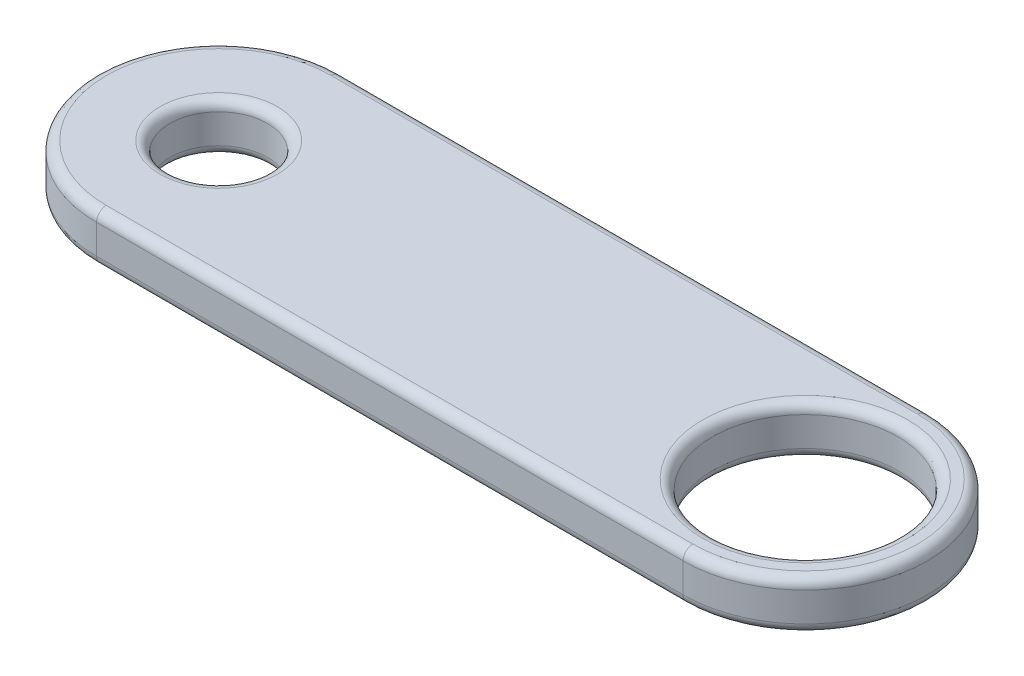
ISO-10303-21;
HEADER;
FILE_DESCRIPTION(('STEP AP214'),'2;1');
FILE_NAME('part.step','',(''),(''),'','','');
FILE_SCHEMA(('AUTOMOTIVE_DESIGN { 1 0 10303 214 1 1 1 1 }'));
ENDSEC;
DATA;
#1=APPLICATION_CONTEXT('core data for automotive mechanical design processes');
#2=APPLICATION_PROTOCOL_DEFINITION('international standard','automotive_design',2000,#1);
#3=PRODUCT_CONTEXT('',#1,'mechanical');
#4=PRODUCT('Part','Part','',(#3));
#5=PRODUCT_RELATED_PRODUCT_CATEGORY('part','',(#4));
#6=PRODUCT_DEFINITION_FORMATION('','',#4);
#7=PRODUCT_DEFINITION_CONTEXT('part definition',#1,'design');
#8=PRODUCT_DEFINITION('design','',#6,#7);
#9=PRODUCT_DEFINITION_SHAPE('','',#8);
#10=(LENGTH_UNIT() NAMED_UNIT(*) SI_UNIT(.MILLI.,.METRE.));
#11=(NAMED_UNIT(*) PLANE_ANGLE_UNIT() SI_UNIT($,.RADIAN.));
#12=(NAMED_UNIT(*) SI_UNIT($,.STERADIAN.) SOLID_ANGLE_UNIT());
#13=UNCERTAINTY_MEASURE_WITH_UNIT(LENGTH_MEASURE(1.E-05),#10,'distance_accuracy_value','');
#14=(GEOMETRIC_REPRESENTATION_CONTEXT(3) GLOBAL_UNCERTAINTY_ASSIGNED_CONTEXT((#13)) GLOBAL_UNIT_ASSIGNED_CONTEXT((#10,
#11,#12)) REPRESENTATION_CONTEXT('',''));
#15=CARTESIAN_POINT('',(0.,0.,0.));
#16=DIRECTION('',(0.,0.,1.));
#17=DIRECTION('',(1.,0.,0.));
#18=AXIS2_PLACEMENT_3D('',#15,#16,#17);
#19=CARTESIAN_POINT('',(0.,2.5,0.));
#20=DIRECTION('',(0.,1.,0.));
#21=DIRECTION('',(0.,0.,1.));
#22=AXIS2_PLACEMENT_3D('',#19,#20,#21);
#23=PLANE('',#22);
#24=CARTESIAN_POINT('',(60.,2.5,0.));
#25=DIRECTION('',(0.,1.,0.));
#26=DIRECTION('',(0.,0.,1.));
#27=AXIS2_PLACEMENT_3D('',#24,#25,#26);
#28=CIRCLE('',#27,10.5);
#29=CARTESIAN_POINT('',(60.,2.5,10.5));
#30=VERTEX_POINT('',#29);
#31=EDGE_CURVE('E11',#30,#30,#28,.F.);
#32=ORIENTED_EDGE('',*,*,#31,.T.);
#33=EDGE_LOOP('',(#32));
#34=FACE_BOUND('',#33,.T.);
#35=CARTESIAN_POINT('',(60.,2.5,0.));
#36=DIRECTION('',(0.,1.,0.));
#37=DIRECTION('',(0.,0.,1.));
#38=AXIS2_PLACEMENT_3D('',#35,#36,#37);
#39=CIRCLE('',#38,11.5);
#40=CARTESIAN_POINT('',(60.,2.5,11.5));
#41=VERTEX_POINT('',#40);
#42=CARTESIAN_POINT('',(60.,2.5,-11.5));
#43=VERTEX_POINT('',#42);
#44=EDGE_CURVE('E57',#41,#43,#39,.T.);
#45=ORIENTED_EDGE('',*,*,#44,.T.);
#46=DIRECTION('',(-1.,0.,0.));
#47=VECTOR('',#46,1.);
#48=CARTESIAN_POINT('',(0.,2.5,-11.5));
#49=LINE('',#48,#47);
#50=CARTESIAN_POINT('',(0.,2.5,-11.5));
#51=VERTEX_POINT('',#50);
#52=EDGE_CURVE('E49',#43,#51,#49,.T.);
#53=ORIENTED_EDGE('',*,*,#52,.T.);
#54=CARTESIAN_POINT('',(0.,2.5,0.));
#55=DIRECTION('',(0.,1.,0.));
#56=DIRECTION('',(0.,0.,1.));
#57=AXIS2_PLACEMENT_3D('',#54,#55,#56);
#58=CIRCLE('',#57,11.5);
#59=CARTESIAN_POINT('',(0.,2.5,11.5));
#60=VERTEX_POINT('',#59);
#61=EDGE_CURVE('E194',#51,#60,#58,.T.);
#62=ORIENTED_EDGE('',*,*,#61,.T.);
#63=DIRECTION('',(1.,0.,0.));
#64=VECTOR('',#63,1.);
#65=CARTESIAN_POINT('',(60.,2.5,11.5));
#66=LINE('',#65,#64);
#67=EDGE_CURVE('E62',#60,#41,#66,.T.);
#68=ORIENTED_EDGE('',*,*,#67,.T.);
#69=EDGE_LOOP('',(#45,#53,#62,#68));
#70=FACE_BOUND('',#69,.T.);
#71=CARTESIAN_POINT('',(0.,2.5,0.));
#72=DIRECTION('',(0.,1.,0.));
#73=DIRECTION('',(0.,0.,1.));
#74=AXIS2_PLACEMENT_3D('',#71,#72,#73);
#75=CIRCLE('',#74,6.);
#76=CARTESIAN_POINT('',(0.,2.5,6.));
#77=VERTEX_POINT('',#76);
#78=EDGE_CURVE('E190',#77,#77,#75,.F.);
#79=ORIENTED_EDGE('',*,*,#78,.T.);
#80=EDGE_LOOP('',(#79));
#81=FACE_BOUND('',#80,.T.);
#82=ADVANCED_FACE('F39',(#34,#70,#81),#23,.T.);
#83=CARTESIAN_POINT('',(0.,-2.5,0.));
#84=DIRECTION('',(0.,1.,0.));
#85=DIRECTION('',(0.,0.,1.));
#86=AXIS2_PLACEMENT_3D('',#83,#84,#85);
#87=PLANE('',#86);
#88=CARTESIAN_POINT('',(60.,-2.5,0.));
#89=DIRECTION('',(0.,1.,0.));
#90=DIRECTION('',(0.,0.,1.));
#91=AXIS2_PLACEMENT_3D('',#88,#89,#90);
#92=CIRCLE('',#91,10.5);
#93=CARTESIAN_POINT('',(60.,-2.5,10.5));
#94=VERTEX_POINT('',#93);
#95=EDGE_CURVE('E142',#94,#94,#92,.T.);
#96=ORIENTED_EDGE('',*,*,#95,.T.);
#97=EDGE_LOOP('',(#96));
#98=FACE_BOUND('',#97,.T.);
#99=CARTESIAN_POINT('',(0.,-2.5,0.));
#100=DIRECTION('',(0.,1.,0.));
#101=DIRECTION('',(0.,0.,1.));
#102=AXIS2_PLACEMENT_3D('',#99,#100,#101);
#103=CIRCLE('',#102,6.);
#104=CARTESIAN_POINT('',(0.,-2.5,6.));
#105=VERTEX_POINT('',#104);
#106=EDGE_CURVE('E137',#105,#105,#103,.T.);
#107=ORIENTED_EDGE('',*,*,#106,.T.);
#108=EDGE_LOOP('',(#107));
#109=FACE_BOUND('',#108,.T.);
#110=CARTESIAN_POINT('',(60.,-2.5,0.));
#111=DIRECTION('',(0.,1.,0.));
#112=DIRECTION('',(0.,0.,1.));
#113=AXIS2_PLACEMENT_3D('',#110,#111,#112);
#114=CIRCLE('',#113,11.5);
#115=CARTESIAN_POINT('',(60.,-2.5,-11.5));
#116=VERTEX_POINT('',#115);
#117=CARTESIAN_POINT('',(60.,-2.5,11.5));
#118=VERTEX_POINT('',#117);
#119=EDGE_CURVE('E135',#116,#118,#114,.F.);
#120=ORIENTED_EDGE('',*,*,#119,.T.);
#121=DIRECTION('',(1.,0.,0.));
#122=VECTOR('',#121,1.);
#123=CARTESIAN_POINT('',(0.,-2.5,11.5));
#124=LINE('',#123,#122);
#125=CARTESIAN_POINT('',(0.,-2.5,11.5));
#126=VERTEX_POINT('',#125);
#127=EDGE_CURVE('E112',#118,#126,#124,.F.);
#128=ORIENTED_EDGE('',*,*,#127,.T.);
#129=CARTESIAN_POINT('',(0.,-2.5,0.));
#130=DIRECTION('',(0.,1.,0.));
#131=DIRECTION('',(0.,0.,1.));
#132=AXIS2_PLACEMENT_3D('',#129,#130,#131);
#133=CIRCLE('',#132,11.5);
#134=CARTESIAN_POINT('',(0.,-2.5,-11.5));
#135=VERTEX_POINT('',#134);
#136=EDGE_CURVE('E123',#126,#135,#133,.F.);
#137=ORIENTED_EDGE('',*,*,#136,.T.);
#138=DIRECTION('',(-1.,0.,0.));
#139=VECTOR('',#138,1.);
#140=CARTESIAN_POINT('',(0.,-2.5,-11.5));
#141=LINE('',#140,#139);
#142=EDGE_CURVE('E130',#135,#116,#141,.F.);
#143=ORIENTED_EDGE('',*,*,#142,.T.);
#144=EDGE_LOOP('',(#120,#128,#137,#143));
#145=FACE_BOUND('',#144,.T.);
#146=ADVANCED_FACE('F133',(#98,#109,#145),#87,.F.);
#147=CARTESIAN_POINT('',(0.,2.5,0.));
#148=DIRECTION('',(0.,-1.,0.));
#149=DIRECTION('',(0.,0.,-1.));
#150=AXIS2_PLACEMENT_3D('',#147,#148,#149);
#151=CYLINDRICAL_SURFACE('',#150,12.5);
#152=DIRECTION('',(0.,-1.,0.));
#153=VECTOR('',#152,1.);
#154=CARTESIAN_POINT('',(0.,2.5,-12.5));
#155=LINE('',#154,#153);
#156=CARTESIAN_POINT('',(0.,1.5,-12.5));
#157=VERTEX_POINT('',#156);
#158=CARTESIAN_POINT('',(0.,-1.5,-12.5));
#159=VERTEX_POINT('',#158);
#160=EDGE_CURVE('E210',#157,#159,#155,.T.);
#161=ORIENTED_EDGE('',*,*,#160,.T.);
#162=CARTESIAN_POINT('',(0.,-1.5,0.));
#163=DIRECTION('',(0.,1.,0.));
#164=DIRECTION('',(0.,0.,1.));
#165=AXIS2_PLACEMENT_3D('',#162,#163,#164);
#166=CIRCLE('',#165,12.5);
#167=CARTESIAN_POINT('',(0.,-1.5,12.5));
#168=VERTEX_POINT('',#167);
#169=EDGE_CURVE('E187',#159,#168,#166,.T.);
#170=ORIENTED_EDGE('',*,*,#169,.T.);
#171=DIRECTION('',(0.,-1.,0.));
#172=VECTOR('',#171,1.);
#173=CARTESIAN_POINT('',(0.,2.5,12.5));
#174=LINE('',#173,#172);
#175=CARTESIAN_POINT('',(0.,1.5,12.5));
#176=VERTEX_POINT('',#175);
#177=EDGE_CURVE('E131',#176,#168,#174,.T.);
#178=ORIENTED_EDGE('',*,*,#177,.F.);
#179=CARTESIAN_POINT('',(0.,1.5,0.));
#180=DIRECTION('',(0.,1.,0.));
#181=DIRECTION('',(0.,0.,1.));
#182=AXIS2_PLACEMENT_3D('',#179,#180,#181);
#183=CIRCLE('',#182,12.5);
#184=EDGE_CURVE('E184',#176,#157,#183,.F.);
#185=ORIENTED_EDGE('',*,*,#184,.T.);
#186=EDGE_LOOP('',(#161,#170,#178,#185));
#187=FACE_BOUND('',#186,.T.);
#188=ADVANCED_FACE('F240',(#187),#151,.T.);
#189=CARTESIAN_POINT('',(0.,2.5,12.5));
#190=DIRECTION('',(0.,0.,-1.));
#191=DIRECTION('',(-1.,0.,0.));
#192=AXIS2_PLACEMENT_3D('',#189,#190,#191);
#193=PLANE('',#192);
#194=ORIENTED_EDGE('',*,*,#177,.T.);
#195=DIRECTION('',(1.,0.,0.));
#196=VECTOR('',#195,1.);
#197=CARTESIAN_POINT('',(0.,-1.5,12.5));
#198=LINE('',#197,#196);
#199=CARTESIAN_POINT('',(60.,-1.5,12.5));
#200=VERTEX_POINT('',#199);
#201=EDGE_CURVE('E115',#168,#200,#198,.T.);
#202=ORIENTED_EDGE('',*,*,#201,.T.);
#203=DIRECTION('',(0.,-1.,0.));
#204=VECTOR('',#203,1.);
#205=CARTESIAN_POINT('',(60.,2.5,12.5));
#206=LINE('',#205,#204);
#207=CARTESIAN_POINT('',(60.,1.5,12.5));
#208=VERTEX_POINT('',#207);
#209=EDGE_CURVE('E237',#208,#200,#206,.T.);
#210=ORIENTED_EDGE('',*,*,#209,.F.);
#211=DIRECTION('',(1.,0.,0.));
#212=VECTOR('',#211,1.);
#213=CARTESIAN_POINT('',(0.,1.5,12.5));
#214=LINE('',#213,#212);
#215=EDGE_CURVE('E166',#208,#176,#214,.F.);
#216=ORIENTED_EDGE('',*,*,#215,.T.);
#217=EDGE_LOOP('',(#194,#202,#210,#216));
#218=FACE_BOUND('',#217,.T.);
#219=ADVANCED_FACE('F235',(#218),#193,.F.);
#220=CARTESIAN_POINT('',(60.,2.5,0.));
#221=DIRECTION('',(0.,-1.,0.));
#222=DIRECTION('',(0.,0.,-1.));
#223=AXIS2_PLACEMENT_3D('',#220,#221,#222);
#224=CYLINDRICAL_SURFACE('',#223,12.5);
#225=ORIENTED_EDGE('',*,*,#209,.T.);
#226=CARTESIAN_POINT('',(60.,-1.5,0.));
#227=DIRECTION('',(0.,1.,0.));
#228=DIRECTION('',(0.,0.,1.));
#229=AXIS2_PLACEMENT_3D('',#226,#227,#228);
#230=CIRCLE('',#229,12.5);
#231=CARTESIAN_POINT('',(60.,-1.5,-12.5));
#232=VERTEX_POINT('',#231);
#233=EDGE_CURVE('E174',#200,#232,#230,.T.);
#234=ORIENTED_EDGE('',*,*,#233,.T.);
#235=DIRECTION('',(0.,-1.,0.));
#236=VECTOR('',#235,1.);
#237=CARTESIAN_POINT('',(60.,2.5,-12.5));
#238=LINE('',#237,#236);
#239=CARTESIAN_POINT('',(60.,1.5,-12.5));
#240=VERTEX_POINT('',#239);
#241=EDGE_CURVE('E245',#240,#232,#238,.T.);
#242=ORIENTED_EDGE('',*,*,#241,.F.);
#243=CARTESIAN_POINT('',(60.,1.5,0.));
#244=DIRECTION('',(0.,1.,0.));
#245=DIRECTION('',(0.,0.,1.));
#246=AXIS2_PLACEMENT_3D('',#243,#244,#245);
#247=CIRCLE('',#246,12.5);
#248=EDGE_CURVE('E171',#240,#208,#247,.F.);
#249=ORIENTED_EDGE('',*,*,#248,.T.);
#250=EDGE_LOOP('',(#225,#234,#242,#249));
#251=FACE_BOUND('',#250,.T.);
#252=ADVANCED_FACE('F259',(#251),#224,.T.);
#253=CARTESIAN_POINT('',(0.,2.5,-12.5));
#254=DIRECTION('',(0.,0.,1.));
#255=DIRECTION('',(1.,0.,0.));
#256=AXIS2_PLACEMENT_3D('',#253,#254,#255);
#257=PLANE('',#256);
#258=ORIENTED_EDGE('',*,*,#241,.T.);
#259=DIRECTION('',(-1.,0.,0.));
#260=VECTOR('',#259,1.);
#261=CARTESIAN_POINT('',(0.,-1.5,-12.5));
#262=LINE('',#261,#260);
#263=EDGE_CURVE('E181',#232,#159,#262,.T.);
#264=ORIENTED_EDGE('',*,*,#263,.T.);
#265=ORIENTED_EDGE('',*,*,#160,.F.);
#266=DIRECTION('',(-1.,0.,0.));
#267=VECTOR('',#266,1.);
#268=CARTESIAN_POINT('',(60.,1.5,-12.5));
#269=LINE('',#268,#267);
#270=EDGE_CURVE('E177',#157,#240,#269,.F.);
#271=ORIENTED_EDGE('',*,*,#270,.T.);
#272=EDGE_LOOP('',(#258,#264,#265,#271));
#273=FACE_BOUND('',#272,.T.);
#274=ADVANCED_FACE('F265',(#273),#257,.F.);
#275=CARTESIAN_POINT('',(0.,2.5,0.));
#276=DIRECTION('',(0.,-1.,0.));
#277=DIRECTION('',(0.,0.,-1.));
#278=AXIS2_PLACEMENT_3D('',#275,#276,#277);
#279=CYLINDRICAL_SURFACE('',#278,5.);
#280=CARTESIAN_POINT('',(0.,-1.5,0.));
#281=DIRECTION('',(0.,1.,0.));
#282=DIRECTION('',(0.,0.,1.));
#283=AXIS2_PLACEMENT_3D('',#280,#281,#282);
#284=CIRCLE('',#283,5.);
#285=CARTESIAN_POINT('',(0.,-1.5,5.));
#286=VERTEX_POINT('',#285);
#287=EDGE_CURVE('E162',#286,#286,#284,.F.);
#288=ORIENTED_EDGE('',*,*,#287,.T.);
#289=EDGE_LOOP('',(#288));
#290=FACE_BOUND('',#289,.T.);
#291=CARTESIAN_POINT('',(0.,1.5,0.));
#292=DIRECTION('',(0.,1.,0.));
#293=DIRECTION('',(0.,0.,1.));
#294=AXIS2_PLACEMENT_3D('',#291,#292,#293);
#295=CIRCLE('',#294,5.);
#296=CARTESIAN_POINT('',(0.,1.5,5.));
#297=VERTEX_POINT('',#296);
#298=EDGE_CURVE('E158',#297,#297,#295,.T.);
#299=ORIENTED_EDGE('',*,*,#298,.T.);
#300=EDGE_LOOP('',(#299));
#301=FACE_BOUND('',#300,.T.);
#302=ADVANCED_FACE('F281',(#290,#301),#279,.F.);
#303=CARTESIAN_POINT('',(60.,2.5,0.));
#304=DIRECTION('',(0.,-1.,0.));
#305=DIRECTION('',(0.,0.,-1.));
#306=AXIS2_PLACEMENT_3D('',#303,#304,#305);
#307=CYLINDRICAL_SURFACE('',#306,9.50000000000001);
#308=CARTESIAN_POINT('',(60.,-1.5,0.));
#309=DIRECTION('',(0.,1.,0.));
#310=DIRECTION('',(0.,0.,1.));
#311=AXIS2_PLACEMENT_3D('',#308,#309,#310);
#312=CIRCLE('',#311,9.50000000000001);
#313=CARTESIAN_POINT('',(60.,-1.5,9.50000000000001));
#314=VERTEX_POINT('',#313);
#315=EDGE_CURVE('E154',#314,#314,#312,.F.);
#316=ORIENTED_EDGE('',*,*,#315,.T.);
#317=EDGE_LOOP('',(#316));
#318=FACE_BOUND('',#317,.T.);
#319=CARTESIAN_POINT('',(60.,1.5,0.));
#320=DIRECTION('',(0.,1.,0.));
#321=DIRECTION('',(0.,0.,1.));
#322=AXIS2_PLACEMENT_3D('',#319,#320,#321);
#323=CIRCLE('',#322,9.50000000000001);
#324=CARTESIAN_POINT('',(60.,1.5,9.50000000000001));
#325=VERTEX_POINT('',#324);
#326=EDGE_CURVE('E150',#325,#325,#323,.T.);
#327=ORIENTED_EDGE('',*,*,#326,.T.);
#328=EDGE_LOOP('',(#327));
#329=FACE_BOUND('',#328,.T.);
#330=ADVANCED_FACE('F283',(#318,#329),#307,.F.);
#331=CARTESIAN_POINT('',(60.,-1.5,0.));
#332=DIRECTION('',(0.,1.,0.));
#333=DIRECTION('',(0.,0.,1.));
#334=AXIS2_PLACEMENT_3D('',#331,#332,#333);
#335=TOROIDAL_SURFACE('',#334,10.5,1.);
#336=ORIENTED_EDGE('',*,*,#315,.F.);
#337=EDGE_LOOP('',(#336));
#338=FACE_BOUND('',#337,.T.);
#339=ORIENTED_EDGE('',*,*,#95,.F.);
#340=EDGE_LOOP('',(#339));
#341=FACE_BOUND('',#340,.T.);
#342=ADVANCED_FACE('F290',(#338,#341),#335,.T.);
#343=CARTESIAN_POINT('',(0.,-1.5,0.));
#344=DIRECTION('',(0.,1.,0.));
#345=DIRECTION('',(0.,0.,1.));
#346=AXIS2_PLACEMENT_3D('',#343,#344,#345);
#347=TOROIDAL_SURFACE('',#346,6.,1.);
#348=ORIENTED_EDGE('',*,*,#287,.F.);
#349=EDGE_LOOP('',(#348));
#350=FACE_BOUND('',#349,.T.);
#351=ORIENTED_EDGE('',*,*,#106,.F.);
#352=EDGE_LOOP('',(#351));
#353=FACE_BOUND('',#352,.T.);
#354=ADVANCED_FACE('F306',(#350,#353),#347,.T.);
#355=CARTESIAN_POINT('',(0.,-1.5,-11.5));
#356=DIRECTION('',(-1.,0.,0.));
#357=DIRECTION('',(0.,0.,1.));
#358=AXIS2_PLACEMENT_3D('',#355,#356,#357);
#359=CYLINDRICAL_SURFACE('',#358,1.);
#360=CARTESIAN_POINT('',(60.,-1.5,-11.5));
#361=DIRECTION('',(1.,0.,0.));
#362=DIRECTION('',(0.,0.,-1.));
#363=AXIS2_PLACEMENT_3D('',#360,#361,#362);
#364=CIRCLE('',#363,1.);
#365=EDGE_CURVE('E119',#116,#232,#364,.T.);
#366=ORIENTED_EDGE('',*,*,#365,.F.);
#367=ORIENTED_EDGE('',*,*,#142,.F.);
#368=CARTESIAN_POINT('',(0.,-1.5,-11.5));
#369=DIRECTION('',(-1.,0.,0.));
#370=DIRECTION('',(0.,0.,1.));
#371=AXIS2_PLACEMENT_3D('',#368,#369,#370);
#372=CIRCLE('',#371,1.);
#373=EDGE_CURVE('E126',#159,#135,#372,.T.);
#374=ORIENTED_EDGE('',*,*,#373,.F.);
#375=ORIENTED_EDGE('',*,*,#263,.F.);
#376=EDGE_LOOP('',(#366,#367,#374,#375));
#377=FACE_BOUND('',#376,.T.);
#378=ADVANCED_FACE('F252',(#377),#359,.T.);
#379=CARTESIAN_POINT('',(0.,-1.5,0.));
#380=DIRECTION('',(0.,1.,0.));
#381=DIRECTION('',(0.,0.,1.));
#382=AXIS2_PLACEMENT_3D('',#379,#380,#381);
#383=TOROIDAL_SURFACE('',#382,11.5,1.);
#384=ORIENTED_EDGE('',*,*,#373,.T.);
#385=ORIENTED_EDGE('',*,*,#136,.F.);
#386=CARTESIAN_POINT('',(0.,-1.5,11.5));
#387=DIRECTION('',(1.,0.,0.));
#388=DIRECTION('',(0.,0.,-1.));
#389=AXIS2_PLACEMENT_3D('',#386,#387,#388);
#390=CIRCLE('',#389,1.);
#391=EDGE_CURVE('E108',#168,#126,#390,.T.);
#392=ORIENTED_EDGE('',*,*,#391,.F.);
#393=ORIENTED_EDGE('',*,*,#169,.F.);
#394=EDGE_LOOP('',(#384,#385,#392,#393));
#395=FACE_BOUND('',#394,.T.);
#396=ADVANCED_FACE('F124',(#395),#383,.T.);
#397=CARTESIAN_POINT('',(60.,-1.5,0.));
#398=DIRECTION('',(0.,1.,0.));
#399=DIRECTION('',(0.,0.,1.));
#400=AXIS2_PLACEMENT_3D('',#397,#398,#399);
#401=TOROIDAL_SURFACE('',#400,11.5,1.);
#402=ORIENTED_EDGE('',*,*,#365,.T.);
#403=ORIENTED_EDGE('',*,*,#233,.F.);
#404=CARTESIAN_POINT('',(60.,-1.5,11.5));
#405=DIRECTION('',(-1.,0.,0.));
#406=DIRECTION('',(0.,0.,1.));
#407=AXIS2_PLACEMENT_3D('',#404,#405,#406);
#408=CIRCLE('',#407,1.);
#409=EDGE_CURVE('E120',#118,#200,#408,.T.);
#410=ORIENTED_EDGE('',*,*,#409,.F.);
#411=ORIENTED_EDGE('',*,*,#119,.F.);
#412=EDGE_LOOP('',(#402,#403,#410,#411));
#413=FACE_BOUND('',#412,.T.);
#414=ADVANCED_FACE('F255',(#413),#401,.T.);
#415=CARTESIAN_POINT('',(0.,-1.5,11.5));
#416=DIRECTION('',(1.,0.,0.));
#417=DIRECTION('',(0.,0.,-1.));
#418=AXIS2_PLACEMENT_3D('',#415,#416,#417);
#419=CYLINDRICAL_SURFACE('',#418,1.);
#420=ORIENTED_EDGE('',*,*,#391,.T.);
#421=ORIENTED_EDGE('',*,*,#127,.F.);
#422=ORIENTED_EDGE('',*,*,#409,.T.);
#423=ORIENTED_EDGE('',*,*,#201,.F.);
#424=EDGE_LOOP('',(#420,#421,#422,#423));
#425=FACE_BOUND('',#424,.T.);
#426=ADVANCED_FACE('F110',(#425),#419,.T.);
#427=CARTESIAN_POINT('',(60.,1.5,0.));
#428=DIRECTION('',(0.,1.,0.));
#429=DIRECTION('',(0.,0.,1.));
#430=AXIS2_PLACEMENT_3D('',#427,#428,#429);
#431=TOROIDAL_SURFACE('',#430,10.5,1.);
#432=ORIENTED_EDGE('',*,*,#31,.F.);
#433=EDGE_LOOP('',(#432));
#434=FACE_BOUND('',#433,.T.);
#435=ORIENTED_EDGE('',*,*,#326,.F.);
#436=EDGE_LOOP('',(#435));
#437=FACE_BOUND('',#436,.T.);
#438=ADVANCED_FACE('F313',(#434,#437),#431,.T.);
#439=CARTESIAN_POINT('',(0.,1.5,11.5));
#440=DIRECTION('',(-1.,0.,0.));
#441=DIRECTION('',(0.,0.,1.));
#442=AXIS2_PLACEMENT_3D('',#439,#440,#441);
#443=CYLINDRICAL_SURFACE('',#442,1.);
#444=CARTESIAN_POINT('',(0.,1.5,11.5));
#445=DIRECTION('',(-1.,0.,0.));
#446=DIRECTION('',(0.,0.,1.));
#447=AXIS2_PLACEMENT_3D('',#444,#445,#446);
#448=CIRCLE('',#447,1.);
#449=EDGE_CURVE('E216',#176,#60,#448,.T.);
#450=ORIENTED_EDGE('',*,*,#449,.F.);
#451=ORIENTED_EDGE('',*,*,#215,.F.);
#452=CARTESIAN_POINT('',(60.,1.5,11.5));
#453=DIRECTION('',(1.,0.,0.));
#454=DIRECTION('',(0.,0.,-1.));
#455=AXIS2_PLACEMENT_3D('',#452,#453,#454);
#456=CIRCLE('',#455,1.);
#457=EDGE_CURVE('E43',#41,#208,#456,.T.);
#458=ORIENTED_EDGE('',*,*,#457,.F.);
#459=ORIENTED_EDGE('',*,*,#67,.F.);
#460=EDGE_LOOP('',(#450,#451,#458,#459));
#461=FACE_BOUND('',#460,.T.);
#462=ADVANCED_FACE('F230',(#461),#443,.T.);
#463=CARTESIAN_POINT('',(60.,1.5,0.));
#464=DIRECTION('',(0.,1.,0.));
#465=DIRECTION('',(0.,0.,1.));
#466=AXIS2_PLACEMENT_3D('',#463,#464,#465);
#467=TOROIDAL_SURFACE('',#466,11.5,1.);
#468=ORIENTED_EDGE('',*,*,#457,.T.);
#469=ORIENTED_EDGE('',*,*,#248,.F.);
#470=CARTESIAN_POINT('',(60.,1.5,-11.5));
#471=DIRECTION('',(-1.,0.,0.));
#472=DIRECTION('',(0.,0.,1.));
#473=AXIS2_PLACEMENT_3D('',#470,#471,#472);
#474=CIRCLE('',#473,1.);
#475=EDGE_CURVE('E214',#43,#240,#474,.T.);
#476=ORIENTED_EDGE('',*,*,#475,.F.);
#477=ORIENTED_EDGE('',*,*,#44,.F.);
#478=EDGE_LOOP('',(#468,#469,#476,#477));
#479=FACE_BOUND('',#478,.T.);
#480=ADVANCED_FACE('F227',(#479),#467,.T.);
#481=CARTESIAN_POINT('',(0.,1.5,0.));
#482=DIRECTION('',(0.,1.,0.));
#483=DIRECTION('',(0.,0.,1.));
#484=AXIS2_PLACEMENT_3D('',#481,#482,#483);
#485=TOROIDAL_SURFACE('',#484,11.5,1.);
#486=ORIENTED_EDGE('',*,*,#449,.T.);
#487=ORIENTED_EDGE('',*,*,#61,.F.);
#488=CARTESIAN_POINT('',(0.,1.5,-11.5));
#489=DIRECTION('',(1.,0.,0.));
#490=DIRECTION('',(0.,1.,0.));
#491=AXIS2_PLACEMENT_3D('',#488,#489,#490);
#492=CIRCLE('',#491,1.);
#493=EDGE_CURVE('E211',#157,#51,#492,.T.);
#494=ORIENTED_EDGE('',*,*,#493,.F.);
#495=ORIENTED_EDGE('',*,*,#184,.F.);
#496=EDGE_LOOP('',(#486,#487,#494,#495));
#497=FACE_BOUND('',#496,.T.);
#498=ADVANCED_FACE('F270',(#497),#485,.T.);
#499=CARTESIAN_POINT('',(0.,1.5,-11.5));
#500=DIRECTION('',(1.,0.,0.));
#501=DIRECTION('',(0.,0.,-1.));
#502=AXIS2_PLACEMENT_3D('',#499,#500,#501);
#503=CYLINDRICAL_SURFACE('',#502,1.);
#504=ORIENTED_EDGE('',*,*,#475,.T.);
#505=ORIENTED_EDGE('',*,*,#270,.F.);
#506=ORIENTED_EDGE('',*,*,#493,.T.);
#507=ORIENTED_EDGE('',*,*,#52,.F.);
#508=EDGE_LOOP('',(#504,#505,#506,#507));
#509=FACE_BOUND('',#508,.T.);
#510=ADVANCED_FACE('F268',(#509),#503,.T.);
#511=CARTESIAN_POINT('',(0.,1.5,0.));
#512=DIRECTION('',(0.,1.,0.));
#513=DIRECTION('',(0.,0.,1.));
#514=AXIS2_PLACEMENT_3D('',#511,#512,#513);
#515=TOROIDAL_SURFACE('',#514,6.,1.);
#516=ORIENTED_EDGE('',*,*,#78,.F.);
#517=EDGE_LOOP('',(#516));
#518=FACE_BOUND('',#517,.T.);
#519=ORIENTED_EDGE('',*,*,#298,.F.);
#520=EDGE_LOOP('',(#519));
#521=FACE_BOUND('',#520,.T.);
#522=ADVANCED_FACE('F41',(#518,#521),#515,.T.);
#523=CLOSED_SHELL('',(#82,#146,#188,#219,#252,#274,#302,#330,#342,#354,#378,#396,#414,#426,#438,
#462,#480,#498,#510,#522));
#524=MANIFOLD_SOLID_BREP('B2',#523);
#525=ADVANCED_BREP_SHAPE_REPRESENTATION('',(#18,#524),#14);
#526=SHAPE_DEFINITION_REPRESENTATION(#9,#525);
ENDSEC;
END-ISO-10303-21;
